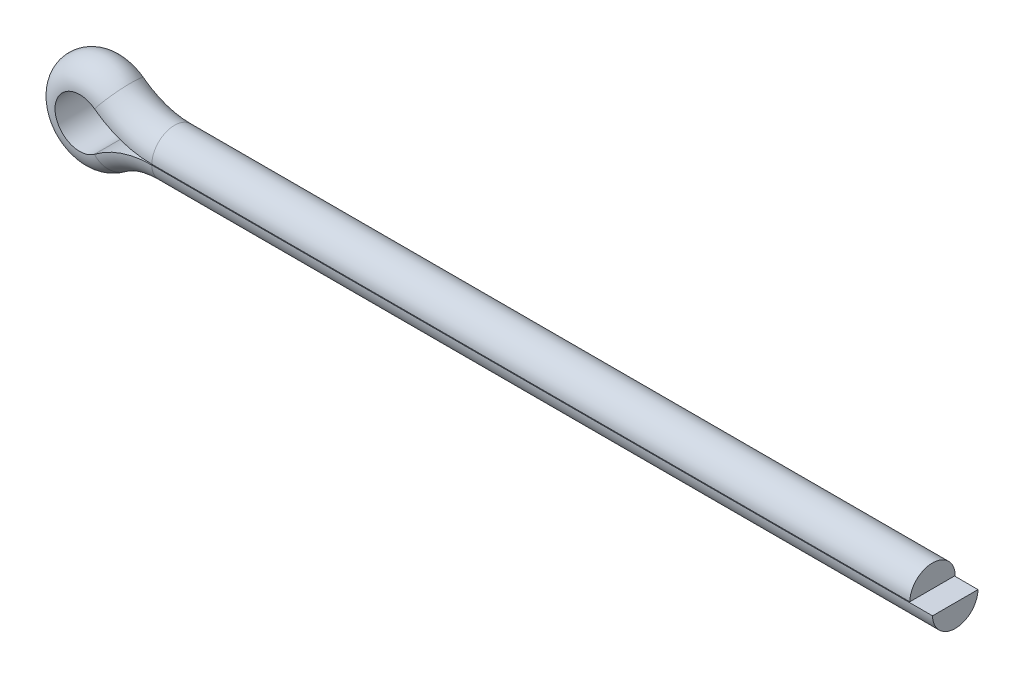
ISO-10303-21;
HEADER;
FILE_DESCRIPTION(('STEP AP214'),'2;1');
FILE_NAME('part.step','',(''),(''),'','','');
FILE_SCHEMA(('AUTOMOTIVE_DESIGN { 1 0 10303 214 1 1 1 1 }'));
ENDSEC;
DATA;
#1=APPLICATION_CONTEXT('core data for automotive mechanical design processes');
#2=APPLICATION_PROTOCOL_DEFINITION('international standard','automotive_design',2000,#1);
#3=PRODUCT_CONTEXT('',#1,'mechanical');
#4=PRODUCT('Part','Part','',(#3));
#5=PRODUCT_RELATED_PRODUCT_CATEGORY('part','',(#4));
#6=PRODUCT_DEFINITION_FORMATION('','',#4);
#7=PRODUCT_DEFINITION_CONTEXT('part definition',#1,'design');
#8=PRODUCT_DEFINITION('design','',#6,#7);
#9=PRODUCT_DEFINITION_SHAPE('','',#8);
#10=(LENGTH_UNIT() NAMED_UNIT(*) SI_UNIT(.MILLI.,.METRE.));
#11=(NAMED_UNIT(*) PLANE_ANGLE_UNIT() SI_UNIT($,.RADIAN.));
#12=(NAMED_UNIT(*) SI_UNIT($,.STERADIAN.) SOLID_ANGLE_UNIT());
#13=UNCERTAINTY_MEASURE_WITH_UNIT(LENGTH_MEASURE(1.E-05),#10,'distance_accuracy_value','');
#14=(GEOMETRIC_REPRESENTATION_CONTEXT(3) GLOBAL_UNCERTAINTY_ASSIGNED_CONTEXT((#13)) GLOBAL_UNIT_ASSIGNED_CONTEXT((#10,
#11,#12)) REPRESENTATION_CONTEXT('',''));
#15=CARTESIAN_POINT('',(0.,0.,0.));
#16=DIRECTION('',(0.,0.,1.));
#17=DIRECTION('',(1.,0.,0.));
#18=AXIS2_PLACEMENT_3D('',#15,#16,#17);
#19=CARTESIAN_POINT('',(0.,0.,0.));
#20=DIRECTION('',(1.,0.,0.));
#21=DIRECTION('',(0.,0.,-1.));
#22=AXIS2_PLACEMENT_3D('',#19,#20,#21);
#23=PLANE('',#22);
#24=CARTESIAN_POINT('',(0.,0.,0.));
#25=DIRECTION('',(1.,0.,0.));
#26=DIRECTION('',(0.,0.,-1.));
#27=AXIS2_PLACEMENT_3D('',#24,#25,#26);
#28=CIRCLE('',#27,1.524);
#29=CARTESIAN_POINT('',(0.,0.0254000000000001,-1.52378831863222));
#30=VERTEX_POINT('',#29);
#31=CARTESIAN_POINT('',(0.,0.0254,1.52378831863222));
#32=VERTEX_POINT('',#31);
#33=EDGE_CURVE('E93',#30,#32,#28,.T.);
#34=ORIENTED_EDGE('',*,*,#33,.T.);
#35=DIRECTION('',(0.,0.,-1.));
#36=VECTOR('',#35,1.);
#37=CARTESIAN_POINT('',(0.,0.0254,1.52378831863222));
#38=LINE('',#37,#36);
#39=EDGE_CURVE('E103',#32,#30,#38,.T.);
#40=ORIENTED_EDGE('',*,*,#39,.T.);
#41=EDGE_LOOP('',(#34,#40));
#42=FACE_BOUND('',#41,.T.);
#43=ADVANCED_FACE('F41',(#42),#23,.T.);
#44=CARTESIAN_POINT('',(1.52399999999998,0.,0.));
#45=DIRECTION('',(-1.,0.,0.));
#46=DIRECTION('',(0.,0.,-1.));
#47=AXIS2_PLACEMENT_3D('',#44,#45,#46);
#48=PLANE('',#47);
#49=CARTESIAN_POINT('',(1.52399999999998,0.,0.));
#50=DIRECTION('',(-1.,0.,0.));
#51=DIRECTION('',(0.,0.,-1.));
#52=AXIS2_PLACEMENT_3D('',#49,#50,#51);
#53=CIRCLE('',#52,1.524);
#54=CARTESIAN_POINT('',(1.52399999999998,-0.0254000000000001,-1.52378831863222));
#55=VERTEX_POINT('',#54);
#56=CARTESIAN_POINT('',(1.52399999999998,-0.0254,1.52378831863222));
#57=VERTEX_POINT('',#56);
#58=EDGE_CURVE('E56',#55,#57,#53,.T.);
#59=ORIENTED_EDGE('',*,*,#58,.F.);
#60=DIRECTION('',(0.,0.,-1.));
#61=VECTOR('',#60,1.);
#62=CARTESIAN_POINT('',(1.52399999999998,-0.0254,1.52378831863222));
#63=LINE('',#62,#61);
#64=EDGE_CURVE('E11',#57,#55,#63,.T.);
#65=ORIENTED_EDGE('',*,*,#64,.F.);
#66=EDGE_LOOP('',(#59,#65));
#67=FACE_BOUND('',#66,.T.);
#68=ADVANCED_FACE('F215',(#67),#48,.F.);
#69=CARTESIAN_POINT('',(0.,0.,0.));
#70=DIRECTION('',(-1.,0.,0.));
#71=DIRECTION('',(0.,-1.,0.));
#72=AXIS2_PLACEMENT_3D('',#69,#70,#71);
#73=CYLINDRICAL_SURFACE('',#72,1.524);
#74=DIRECTION('',(-1.,0.,0.));
#75=VECTOR('',#74,1.);
#76=CARTESIAN_POINT('',(0.,0.0254,1.52378831863222));
#77=LINE('',#76,#75);
#78=CARTESIAN_POINT('',(-50.8,0.0253999999999992,1.52378831863222));
#79=VERTEX_POINT('',#78);
#80=EDGE_CURVE('E100',#32,#79,#77,.T.);
#81=ORIENTED_EDGE('',*,*,#80,.F.);
#82=ORIENTED_EDGE('',*,*,#33,.F.);
#83=DIRECTION('',(-1.,0.,0.));
#84=VECTOR('',#83,1.);
#85=CARTESIAN_POINT('',(0.,0.0254000000000001,-1.52378831863222));
#86=LINE('',#85,#84);
#87=CARTESIAN_POINT('',(-50.8,0.0253999999999993,-1.52378831863222));
#88=VERTEX_POINT('',#87);
#89=EDGE_CURVE('E98',#30,#88,#86,.T.);
#90=ORIENTED_EDGE('',*,*,#89,.T.);
#91=CARTESIAN_POINT('',(-50.8,0.,0.));
#92=DIRECTION('',(1.,0.,0.));
#93=DIRECTION('',(0.,0.,-1.));
#94=AXIS2_PLACEMENT_3D('',#91,#92,#93);
#95=CIRCLE('',#94,1.524);
#96=EDGE_CURVE('E114',#88,#79,#95,.T.);
#97=ORIENTED_EDGE('',*,*,#96,.T.);
#98=EDGE_LOOP('',(#81,#82,#90,#97));
#99=FACE_BOUND('',#98,.T.);
#100=ADVANCED_FACE('F95',(#99),#73,.T.);
#101=CARTESIAN_POINT('',(0.,0.0254,1.52378831863222));
#102=DIRECTION('',(0.,1.,0.));
#103=DIRECTION('',(0.,0.,1.));
#104=AXIS2_PLACEMENT_3D('',#101,#102,#103);
#105=PLANE('',#104);
#106=DIRECTION('',(0.,0.,-1.));
#107=VECTOR('',#106,1.);
#108=CARTESIAN_POINT('',(-50.8,0.0253999999999992,1.52378831863222));
#109=LINE('',#108,#107);
#110=EDGE_CURVE('E111',#79,#88,#109,.T.);
#111=ORIENTED_EDGE('',*,*,#110,.T.);
#112=ORIENTED_EDGE('',*,*,#89,.F.);
#113=ORIENTED_EDGE('',*,*,#39,.F.);
#114=ORIENTED_EDGE('',*,*,#80,.T.);
#115=EDGE_LOOP('',(#111,#112,#113,#114));
#116=FACE_BOUND('',#115,.T.);
#117=ADVANCED_FACE('F109',(#116),#105,.F.);
#118=CARTESIAN_POINT('',(-50.8,6.3754,0.));
#119=DIRECTION('',(0.,0.,-1.));
#120=DIRECTION('',(-1.,0.,0.));
#121=AXIS2_PLACEMENT_3D('',#118,#119,#120);
#122=TOROIDAL_SURFACE('',#121,6.3754,1.524);
#123=CARTESIAN_POINT('',(-50.8,6.3754,1.52378831863222));
#124=DIRECTION('',(0.,0.,-1.));
#125=DIRECTION('',(0.,-1.,0.));
#126=AXIS2_PLACEMENT_3D('',#123,#124,#125);
#127=CIRCLE('',#126,6.35);
#128=CARTESIAN_POINT('',(-54.6367312029918,1.31555873015873,1.52378831863222));
#129=VERTEX_POINT('',#128);
#130=EDGE_CURVE('E125',#79,#129,#127,.T.);
#131=ORIENTED_EDGE('',*,*,#130,.F.);
#132=ORIENTED_EDGE('',*,*,#96,.F.);
#133=CARTESIAN_POINT('',(-50.8,6.3754,-1.52378831863222));
#134=DIRECTION('',(0.,0.,-1.));
#135=DIRECTION('',(0.,-1.,0.));
#136=AXIS2_PLACEMENT_3D('',#133,#134,#135);
#137=CIRCLE('',#136,6.35);
#138=CARTESIAN_POINT('',(-54.6367312029918,1.31555873015873,-1.52378831863222));
#139=VERTEX_POINT('',#138);
#140=EDGE_CURVE('E126',#88,#139,#137,.T.);
#141=ORIENTED_EDGE('',*,*,#140,.T.);
#142=CARTESIAN_POINT('',(-54.6520781278038,1.29531936507937,0.));
#143=DIRECTION('',(0.796825396825396,-0.60420963826643,0.));
#144=DIRECTION('',(0.,0.,-1.));
#145=AXIS2_PLACEMENT_3D('',#142,#143,#144);
#146=CIRCLE('',#145,1.524);
#147=EDGE_CURVE('E121',#139,#129,#146,.T.);
#148=ORIENTED_EDGE('',*,*,#147,.T.);
#149=EDGE_LOOP('',(#131,#132,#141,#148));
#150=FACE_BOUND('',#149,.T.);
#151=ADVANCED_FACE('F195',(#150),#122,.T.);
#152=CARTESIAN_POINT('',(-50.8,6.3754,0.));
#153=DIRECTION('',(0.,0.,-1.));
#154=DIRECTION('',(-1.,0.,0.));
#155=AXIS2_PLACEMENT_3D('',#152,#153,#154);
#156=CYLINDRICAL_SURFACE('',#155,6.35);
#157=DIRECTION('',(0.,0.,-1.));
#158=VECTOR('',#157,1.);
#159=CARTESIAN_POINT('',(-54.6367312029918,1.31555873015874,1.52378831863222));
#160=LINE('',#159,#158);
#161=EDGE_CURVE('E130',#129,#139,#160,.T.);
#162=ORIENTED_EDGE('',*,*,#161,.T.);
#163=ORIENTED_EDGE('',*,*,#140,.F.);
#164=ORIENTED_EDGE('',*,*,#110,.F.);
#165=ORIENTED_EDGE('',*,*,#130,.T.);
#166=EDGE_LOOP('',(#162,#163,#164,#165));
#167=FACE_BOUND('',#166,.T.);
#168=ADVANCED_FACE('F193',(#167),#156,.T.);
#169=CARTESIAN_POINT('',(-55.6342813157697,0.,0.));
#170=DIRECTION('',(0.,0.,1.));
#171=DIRECTION('',(1.,0.,0.));
#172=AXIS2_PLACEMENT_3D('',#169,#170,#171);
#173=TOROIDAL_SURFACE('',#172,1.62560000000001,1.524);
#174=CARTESIAN_POINT('',(-55.6342813157697,0.,1.52378831863222));
#175=DIRECTION('',(0.,0.,1.));
#176=DIRECTION('',(0.604209638266432,0.796825396825394,0.));
#177=AXIS2_PLACEMENT_3D('',#174,#175,#176);
#178=CIRCLE('',#177,1.65100000000001);
#179=CARTESIAN_POINT('',(-54.6367312029918,-1.31555873015874,1.52378831863222));
#180=VERTEX_POINT('',#179);
#181=EDGE_CURVE('E138',#129,#180,#178,.T.);
#182=ORIENTED_EDGE('',*,*,#181,.F.);
#183=ORIENTED_EDGE('',*,*,#147,.F.);
#184=CARTESIAN_POINT('',(-55.6342813157697,0.,-1.52378831863222));
#185=DIRECTION('',(0.,0.,1.));
#186=DIRECTION('',(0.604209638266432,0.796825396825394,0.));
#187=AXIS2_PLACEMENT_3D('',#184,#185,#186);
#188=CIRCLE('',#187,1.65100000000001);
#189=CARTESIAN_POINT('',(-54.6367312029918,-1.31555873015874,-1.52378831863222));
#190=VERTEX_POINT('',#189);
#191=EDGE_CURVE('E139',#139,#190,#188,.T.);
#192=ORIENTED_EDGE('',*,*,#191,.T.);
#193=CARTESIAN_POINT('',(-54.6520781278038,-1.29531936507937,0.));
#194=DIRECTION('',(-0.7968253968254,-0.604209638266424,0.));
#195=DIRECTION('',(0.,0.,-1.));
#196=AXIS2_PLACEMENT_3D('',#193,#194,#195);
#197=CIRCLE('',#196,1.524);
#198=EDGE_CURVE('E134',#190,#180,#197,.T.);
#199=ORIENTED_EDGE('',*,*,#198,.T.);
#200=EDGE_LOOP('',(#182,#183,#192,#199));
#201=FACE_BOUND('',#200,.T.);
#202=ADVANCED_FACE('F188',(#201),#173,.T.);
#203=CARTESIAN_POINT('',(-55.6342813157697,0.,0.));
#204=DIRECTION('',(0.,0.,1.));
#205=DIRECTION('',(1.,0.,0.));
#206=AXIS2_PLACEMENT_3D('',#203,#204,#205);
#207=CYLINDRICAL_SURFACE('',#206,1.65100000000001);
#208=DIRECTION('',(0.,0.,-1.));
#209=VECTOR('',#208,1.);
#210=CARTESIAN_POINT('',(-54.6367312029918,-1.31555873015874,1.52378831863222));
#211=LINE('',#210,#209);
#212=EDGE_CURVE('E143',#180,#190,#211,.T.);
#213=ORIENTED_EDGE('',*,*,#212,.T.);
#214=ORIENTED_EDGE('',*,*,#191,.F.);
#215=ORIENTED_EDGE('',*,*,#161,.F.);
#216=ORIENTED_EDGE('',*,*,#181,.T.);
#217=EDGE_LOOP('',(#213,#214,#215,#216));
#218=FACE_BOUND('',#217,.T.);
#219=ADVANCED_FACE('F191',(#218),#207,.F.);
#220=CARTESIAN_POINT('',(-50.8,-6.3754,0.));
#221=DIRECTION('',(0.,0.,-1.));
#222=DIRECTION('',(-1.,0.,0.));
#223=AXIS2_PLACEMENT_3D('',#220,#221,#222);
#224=TOROIDAL_SURFACE('',#223,6.3754,1.524);
#225=CARTESIAN_POINT('',(-50.8,-6.3754,1.52378831863222));
#226=DIRECTION('',(0.,0.,-1.));
#227=DIRECTION('',(-0.604209638266431,0.796825396825395,0.));
#228=AXIS2_PLACEMENT_3D('',#225,#226,#227);
#229=CIRCLE('',#228,6.35);
#230=CARTESIAN_POINT('',(-50.8,-0.0253999999999983,1.52378831863222));
#231=VERTEX_POINT('',#230);
#232=EDGE_CURVE('E151',#180,#231,#229,.T.);
#233=ORIENTED_EDGE('',*,*,#232,.F.);
#234=ORIENTED_EDGE('',*,*,#198,.F.);
#235=CARTESIAN_POINT('',(-50.8,-6.3754,-1.52378831863222));
#236=DIRECTION('',(0.,0.,-1.));
#237=DIRECTION('',(-0.604209638266431,0.796825396825395,0.));
#238=AXIS2_PLACEMENT_3D('',#235,#236,#237);
#239=CIRCLE('',#238,6.35);
#240=CARTESIAN_POINT('',(-50.8,-0.0253999999999983,-1.52378831863222));
#241=VERTEX_POINT('',#240);
#242=EDGE_CURVE('E152',#190,#241,#239,.T.);
#243=ORIENTED_EDGE('',*,*,#242,.T.);
#244=CARTESIAN_POINT('',(-50.8,0.,0.));
#245=DIRECTION('',(-1.,0.,0.));
#246=DIRECTION('',(0.,0.,-1.));
#247=AXIS2_PLACEMENT_3D('',#244,#245,#246);
#248=CIRCLE('',#247,1.524);
#249=EDGE_CURVE('E147',#241,#231,#248,.T.);
#250=ORIENTED_EDGE('',*,*,#249,.T.);
#251=EDGE_LOOP('',(#233,#234,#243,#250));
#252=FACE_BOUND('',#251,.T.);
#253=ADVANCED_FACE('F185',(#252),#224,.T.);
#254=CARTESIAN_POINT('',(-50.8,-6.3754,0.));
#255=DIRECTION('',(0.,0.,-1.));
#256=DIRECTION('',(-1.,0.,0.));
#257=AXIS2_PLACEMENT_3D('',#254,#255,#256);
#258=CYLINDRICAL_SURFACE('',#257,6.35);
#259=DIRECTION('',(0.,0.,-1.));
#260=VECTOR('',#259,1.);
#261=CARTESIAN_POINT('',(-50.8,-0.0254000000000001,1.52378831863222));
#262=LINE('',#261,#260);
#263=EDGE_CURVE('E156',#231,#241,#262,.T.);
#264=ORIENTED_EDGE('',*,*,#263,.T.);
#265=ORIENTED_EDGE('',*,*,#242,.F.);
#266=ORIENTED_EDGE('',*,*,#212,.F.);
#267=ORIENTED_EDGE('',*,*,#232,.T.);
#268=EDGE_LOOP('',(#264,#265,#266,#267));
#269=FACE_BOUND('',#268,.T.);
#270=ADVANCED_FACE('F180',(#269),#258,.T.);
#271=CARTESIAN_POINT('',(-50.8,0.,0.));
#272=DIRECTION('',(1.,0.,0.));
#273=DIRECTION('',(0.,1.,0.));
#274=AXIS2_PLACEMENT_3D('',#271,#272,#273);
#275=CYLINDRICAL_SURFACE('',#274,1.524);
#276=DIRECTION('',(1.,0.,0.));
#277=VECTOR('',#276,1.);
#278=CARTESIAN_POINT('',(-50.8,-0.0253999999999983,1.52378831863222));
#279=LINE('',#278,#277);
#280=EDGE_CURVE('E49',#231,#57,#279,.T.);
#281=ORIENTED_EDGE('',*,*,#280,.F.);
#282=ORIENTED_EDGE('',*,*,#249,.F.);
#283=DIRECTION('',(1.,0.,0.));
#284=VECTOR('',#283,1.);
#285=CARTESIAN_POINT('',(-50.8,-0.0253999999999985,-1.52378831863222));
#286=LINE('',#285,#284);
#287=EDGE_CURVE('E162',#241,#55,#286,.T.);
#288=ORIENTED_EDGE('',*,*,#287,.T.);
#289=ORIENTED_EDGE('',*,*,#58,.T.);
#290=EDGE_LOOP('',(#281,#282,#288,#289));
#291=FACE_BOUND('',#290,.T.);
#292=ADVANCED_FACE('F182',(#291),#275,.T.);
#293=CARTESIAN_POINT('',(-50.8,-0.0253999999999983,1.52378831863222));
#294=DIRECTION('',(0.,-1.,0.));
#295=DIRECTION('',(0.,0.,-1.));
#296=AXIS2_PLACEMENT_3D('',#293,#294,#295);
#297=PLANE('',#296);
#298=ORIENTED_EDGE('',*,*,#64,.T.);
#299=ORIENTED_EDGE('',*,*,#287,.F.);
#300=ORIENTED_EDGE('',*,*,#263,.F.);
#301=ORIENTED_EDGE('',*,*,#280,.T.);
#302=EDGE_LOOP('',(#298,#299,#300,#301));
#303=FACE_BOUND('',#302,.T.);
#304=ADVANCED_FACE('F206',(#303),#297,.F.);
#305=CLOSED_SHELL('',(#43,#68,#100,#117,#151,#168,#202,#219,#253,#270,#292,#304));
#306=MANIFOLD_SOLID_BREP('B2',#305);
#307=ADVANCED_BREP_SHAPE_REPRESENTATION('',(#18,#306),#14);
#308=SHAPE_DEFINITION_REPRESENTATION(#9,#307);
ENDSEC;
END-ISO-10303-21;
